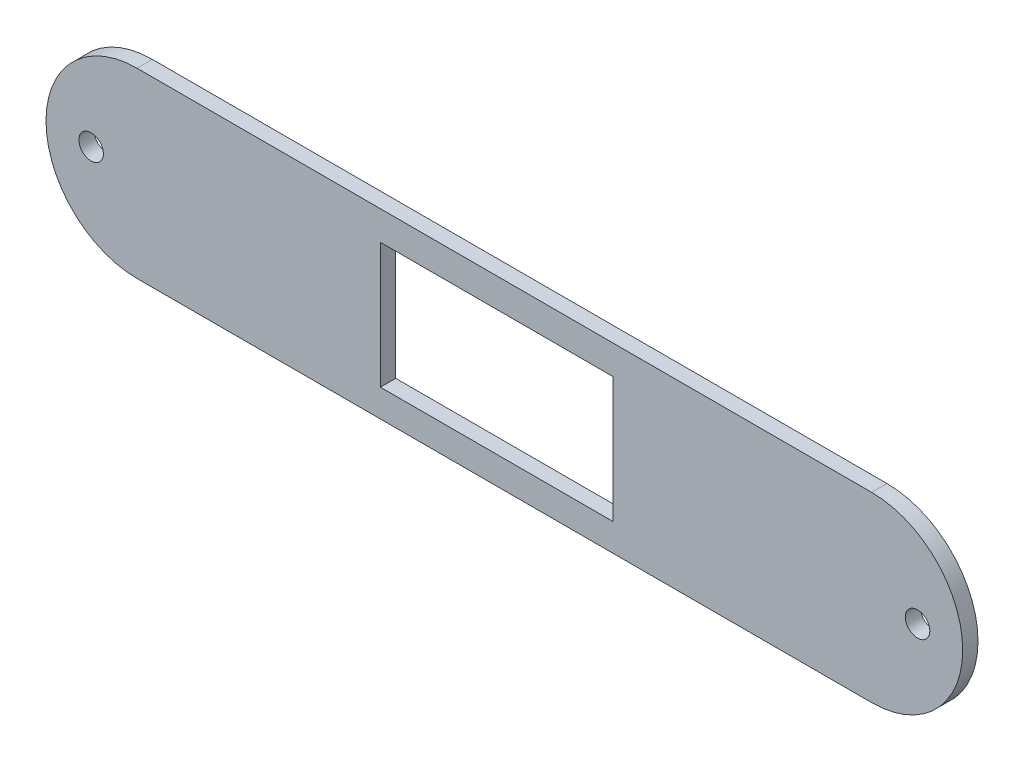
ISO-10303-21;
HEADER;
FILE_DESCRIPTION(('STEP AP214'),'2;1');
FILE_NAME('part.step','',(''),(''),'','','');
FILE_SCHEMA(('AUTOMOTIVE_DESIGN { 1 0 10303 214 1 1 1 1 }'));
ENDSEC;
DATA;
#1=APPLICATION_CONTEXT('core data for automotive mechanical design processes');
#2=APPLICATION_PROTOCOL_DEFINITION('international standard','automotive_design',2000,#1);
#3=PRODUCT_CONTEXT('',#1,'mechanical');
#4=PRODUCT('Part','Part','',(#3));
#5=PRODUCT_RELATED_PRODUCT_CATEGORY('part','',(#4));
#6=PRODUCT_DEFINITION_FORMATION('','',#4);
#7=PRODUCT_DEFINITION_CONTEXT('part definition',#1,'design');
#8=PRODUCT_DEFINITION('design','',#6,#7);
#9=PRODUCT_DEFINITION_SHAPE('','',#8);
#10=(LENGTH_UNIT() NAMED_UNIT(*) SI_UNIT(.MILLI.,.METRE.));
#11=(NAMED_UNIT(*) PLANE_ANGLE_UNIT() SI_UNIT($,.RADIAN.));
#12=(NAMED_UNIT(*) SI_UNIT($,.STERADIAN.) SOLID_ANGLE_UNIT());
#13=UNCERTAINTY_MEASURE_WITH_UNIT(LENGTH_MEASURE(1.E-05),#10,'distance_accuracy_value','');
#14=(GEOMETRIC_REPRESENTATION_CONTEXT(3) GLOBAL_UNCERTAINTY_ASSIGNED_CONTEXT((#13)) GLOBAL_UNIT_ASSIGNED_CONTEXT((#10,
#11,#12)) REPRESENTATION_CONTEXT('',''));
#15=CARTESIAN_POINT('',(0.,0.,0.));
#16=DIRECTION('',(0.,0.,1.));
#17=DIRECTION('',(1.,0.,0.));
#18=AXIS2_PLACEMENT_3D('',#15,#16,#17);
#19=CARTESIAN_POINT('',(24.,0.,1.));
#20=DIRECTION('',(0.,0.,-1.));
#21=DIRECTION('',(-1.,0.,0.));
#22=AXIS2_PLACEMENT_3D('',#19,#20,#21);
#23=CYLINDRICAL_SURFACE('',#22,5.95);
#24=CARTESIAN_POINT('',(24.,0.,0.));
#25=DIRECTION('',(0.,0.,1.));
#26=DIRECTION('',(1.,0.,0.));
#27=AXIS2_PLACEMENT_3D('',#24,#25,#26);
#28=CIRCLE('',#27,5.95);
#29=CARTESIAN_POINT('',(24.,-5.94999999999999,0.));
#30=VERTEX_POINT('',#29);
#31=CARTESIAN_POINT('',(24.,5.95000000000002,0.));
#32=VERTEX_POINT('',#31);
#33=EDGE_CURVE('E145',#30,#32,#28,.T.);
#34=ORIENTED_EDGE('',*,*,#33,.T.);
#35=DIRECTION('',(0.,0.,-1.));
#36=VECTOR('',#35,1.);
#37=CARTESIAN_POINT('',(24.,5.95000000000002,1.));
#38=LINE('',#37,#36);
#39=CARTESIAN_POINT('',(24.,5.95000000000002,1.));
#40=VERTEX_POINT('',#39);
#41=EDGE_CURVE('E11',#40,#32,#38,.T.);
#42=ORIENTED_EDGE('',*,*,#41,.F.);
#43=CARTESIAN_POINT('',(24.,0.,1.));
#44=DIRECTION('',(0.,0.,1.));
#45=DIRECTION('',(1.,0.,0.));
#46=AXIS2_PLACEMENT_3D('',#43,#44,#45);
#47=CIRCLE('',#46,5.95);
#48=CARTESIAN_POINT('',(24.,-5.94999999999999,1.));
#49=VERTEX_POINT('',#48);
#50=EDGE_CURVE('E148',#49,#40,#47,.T.);
#51=ORIENTED_EDGE('',*,*,#50,.F.);
#52=DIRECTION('',(0.,0.,-1.));
#53=VECTOR('',#52,1.);
#54=CARTESIAN_POINT('',(24.,-5.94999999999999,1.));
#55=LINE('',#54,#53);
#56=EDGE_CURVE('E158',#49,#30,#55,.T.);
#57=ORIENTED_EDGE('',*,*,#56,.T.);
#58=EDGE_LOOP('',(#34,#42,#51,#57));
#59=FACE_BOUND('',#58,.T.);
#60=ADVANCED_FACE('F35',(#59),#23,.T.);
#61=CARTESIAN_POINT('',(24.,5.95000000000002,1.));
#62=DIRECTION('',(0.,-1.,0.));
#63=DIRECTION('',(1.,0.,0.));
#64=AXIS2_PLACEMENT_3D('',#61,#62,#63);
#65=PLANE('',#64);
#66=DIRECTION('',(-1.,0.,0.));
#67=VECTOR('',#66,1.);
#68=CARTESIAN_POINT('',(24.,5.95000000000002,0.));
#69=LINE('',#68,#67);
#70=CARTESIAN_POINT('',(-24.,5.95,0.));
#71=VERTEX_POINT('',#70);
#72=EDGE_CURVE('E161',#32,#71,#69,.T.);
#73=ORIENTED_EDGE('',*,*,#72,.T.);
#74=DIRECTION('',(0.,0.,-1.));
#75=VECTOR('',#74,1.);
#76=CARTESIAN_POINT('',(-24.,5.95,1.));
#77=LINE('',#76,#75);
#78=CARTESIAN_POINT('',(-24.,5.95,1.));
#79=VERTEX_POINT('',#78);
#80=EDGE_CURVE('E42',#79,#71,#77,.T.);
#81=ORIENTED_EDGE('',*,*,#80,.F.);
#82=DIRECTION('',(-1.,0.,0.));
#83=VECTOR('',#82,1.);
#84=CARTESIAN_POINT('',(24.,5.95000000000002,1.));
#85=LINE('',#84,#83);
#86=EDGE_CURVE('E151',#40,#79,#85,.T.);
#87=ORIENTED_EDGE('',*,*,#86,.F.);
#88=ORIENTED_EDGE('',*,*,#41,.T.);
#89=EDGE_LOOP('',(#73,#81,#87,#88));
#90=FACE_BOUND('',#89,.T.);
#91=ADVANCED_FACE('F190',(#90),#65,.F.);
#92=CARTESIAN_POINT('',(-24.,0.,1.));
#93=DIRECTION('',(0.,0.,-1.));
#94=DIRECTION('',(-1.,0.,0.));
#95=AXIS2_PLACEMENT_3D('',#92,#93,#94);
#96=CYLINDRICAL_SURFACE('',#95,5.95);
#97=CARTESIAN_POINT('',(-24.,0.,0.));
#98=DIRECTION('',(0.,0.,1.));
#99=DIRECTION('',(1.,0.,0.));
#100=AXIS2_PLACEMENT_3D('',#97,#98,#99);
#101=CIRCLE('',#100,5.95);
#102=CARTESIAN_POINT('',(-24.,-5.95,0.));
#103=VERTEX_POINT('',#102);
#104=EDGE_CURVE('E163',#71,#103,#101,.T.);
#105=ORIENTED_EDGE('',*,*,#104,.T.);
#106=DIRECTION('',(0.,0.,-1.));
#107=VECTOR('',#106,1.);
#108=CARTESIAN_POINT('',(-24.,-5.95,1.));
#109=LINE('',#108,#107);
#110=CARTESIAN_POINT('',(-24.,-5.95,1.));
#111=VERTEX_POINT('',#110);
#112=EDGE_CURVE('E168',#111,#103,#109,.T.);
#113=ORIENTED_EDGE('',*,*,#112,.F.);
#114=CARTESIAN_POINT('',(-24.,0.,1.));
#115=DIRECTION('',(0.,0.,1.));
#116=DIRECTION('',(1.,0.,0.));
#117=AXIS2_PLACEMENT_3D('',#114,#115,#116);
#118=CIRCLE('',#117,5.95);
#119=EDGE_CURVE('E154',#79,#111,#118,.T.);
#120=ORIENTED_EDGE('',*,*,#119,.F.);
#121=ORIENTED_EDGE('',*,*,#80,.T.);
#122=EDGE_LOOP('',(#105,#113,#120,#121));
#123=FACE_BOUND('',#122,.T.);
#124=ADVANCED_FACE('F175',(#123),#96,.T.);
#125=CARTESIAN_POINT('',(-24.,-5.95,1.));
#126=DIRECTION('',(0.,1.,0.));
#127=DIRECTION('',(-1.,0.,0.));
#128=AXIS2_PLACEMENT_3D('',#125,#126,#127);
#129=PLANE('',#128);
#130=DIRECTION('',(1.,0.,0.));
#131=VECTOR('',#130,1.);
#132=CARTESIAN_POINT('',(-24.,-5.95,0.));
#133=LINE('',#132,#131);
#134=EDGE_CURVE('E152',#103,#30,#133,.T.);
#135=ORIENTED_EDGE('',*,*,#134,.T.);
#136=ORIENTED_EDGE('',*,*,#56,.F.);
#137=DIRECTION('',(1.,0.,0.));
#138=VECTOR('',#137,1.);
#139=CARTESIAN_POINT('',(-24.,-5.95,1.));
#140=LINE('',#139,#138);
#141=EDGE_CURVE('E156',#111,#49,#140,.T.);
#142=ORIENTED_EDGE('',*,*,#141,.F.);
#143=ORIENTED_EDGE('',*,*,#112,.T.);
#144=EDGE_LOOP('',(#135,#136,#142,#143));
#145=FACE_BOUND('',#144,.T.);
#146=ADVANCED_FACE('F183',(#145),#129,.F.);
#147=CARTESIAN_POINT('',(24.,0.,1.));
#148=DIRECTION('',(0.,0.,1.));
#149=DIRECTION('',(1.,0.,0.));
#150=AXIS2_PLACEMENT_3D('',#147,#148,#149);
#151=PLANE('',#150);
#152=DIRECTION('',(0.,-1.,0.));
#153=VECTOR('',#152,1.);
#154=CARTESIAN_POINT('',(-8.1,-4.15,1.));
#155=LINE('',#154,#153);
#156=CARTESIAN_POINT('',(-8.1,4.05,1.));
#157=VERTEX_POINT('',#156);
#158=CARTESIAN_POINT('',(-8.1,-4.15,1.));
#159=VERTEX_POINT('',#158);
#160=EDGE_CURVE('E49',#157,#159,#155,.T.);
#161=ORIENTED_EDGE('',*,*,#160,.F.);
#162=DIRECTION('',(-1.,0.,0.));
#163=VECTOR('',#162,1.);
#164=CARTESIAN_POINT('',(-8.1,4.05,1.));
#165=LINE('',#164,#163);
#166=CARTESIAN_POINT('',(7.1,4.05,1.));
#167=VERTEX_POINT('',#166);
#168=EDGE_CURVE('E117',#167,#157,#165,.T.);
#169=ORIENTED_EDGE('',*,*,#168,.F.);
#170=DIRECTION('',(0.,1.,0.));
#171=VECTOR('',#170,1.);
#172=CARTESIAN_POINT('',(7.1,-4.15,1.));
#173=LINE('',#172,#171);
#174=CARTESIAN_POINT('',(7.1,-4.15,1.));
#175=VERTEX_POINT('',#174);
#176=EDGE_CURVE('E120',#175,#167,#173,.T.);
#177=ORIENTED_EDGE('',*,*,#176,.F.);
#178=DIRECTION('',(1.,0.,0.));
#179=VECTOR('',#178,1.);
#180=CARTESIAN_POINT('',(-8.1,-4.15,1.));
#181=LINE('',#180,#179);
#182=EDGE_CURVE('E126',#159,#175,#181,.T.);
#183=ORIENTED_EDGE('',*,*,#182,.F.);
#184=EDGE_LOOP('',(#161,#169,#177,#183));
#185=FACE_BOUND('',#184,.T.);
#186=CARTESIAN_POINT('',(27.,0.,1.));
#187=DIRECTION('',(0.,0.,1.));
#188=DIRECTION('',(1.,0.,0.));
#189=AXIS2_PLACEMENT_3D('',#186,#187,#188);
#190=CIRCLE('',#189,0.799999999999999);
#191=CARTESIAN_POINT('',(27.8,0.,1.));
#192=VERTEX_POINT('',#191);
#193=EDGE_CURVE('E136',#192,#192,#190,.T.);
#194=ORIENTED_EDGE('',*,*,#193,.F.);
#195=EDGE_LOOP('',(#194));
#196=FACE_BOUND('',#195,.T.);
#197=CARTESIAN_POINT('',(-27.,0.,1.));
#198=DIRECTION('',(0.,0.,1.));
#199=DIRECTION('',(1.,0.,0.));
#200=AXIS2_PLACEMENT_3D('',#197,#198,#199);
#201=CIRCLE('',#200,0.799999999999999);
#202=CARTESIAN_POINT('',(-26.2,0.,1.));
#203=VERTEX_POINT('',#202);
#204=EDGE_CURVE('E139',#203,#203,#201,.T.);
#205=ORIENTED_EDGE('',*,*,#204,.F.);
#206=EDGE_LOOP('',(#205));
#207=FACE_BOUND('',#206,.T.);
#208=ORIENTED_EDGE('',*,*,#50,.T.);
#209=ORIENTED_EDGE('',*,*,#86,.T.);
#210=ORIENTED_EDGE('',*,*,#119,.T.);
#211=ORIENTED_EDGE('',*,*,#141,.T.);
#212=EDGE_LOOP('',(#208,#209,#210,#211));
#213=FACE_BOUND('',#212,.T.);
#214=ADVANCED_FACE('F189',(#185,#196,#207,#213),#151,.T.);
#215=CARTESIAN_POINT('',(24.,0.,0.));
#216=DIRECTION('',(0.,0.,1.));
#217=DIRECTION('',(1.,0.,0.));
#218=AXIS2_PLACEMENT_3D('',#215,#216,#217);
#219=PLANE('',#218);
#220=DIRECTION('',(-1.,0.,0.));
#221=VECTOR('',#220,1.);
#222=CARTESIAN_POINT('',(-8.1,4.05,0.));
#223=LINE('',#222,#221);
#224=CARTESIAN_POINT('',(7.1,4.05,0.));
#225=VERTEX_POINT('',#224);
#226=CARTESIAN_POINT('',(-8.1,4.05,0.));
#227=VERTEX_POINT('',#226);
#228=EDGE_CURVE('E107',#225,#227,#223,.T.);
#229=ORIENTED_EDGE('',*,*,#228,.T.);
#230=DIRECTION('',(0.,-1.,0.));
#231=VECTOR('',#230,1.);
#232=CARTESIAN_POINT('',(-8.1,-4.15,0.));
#233=LINE('',#232,#231);
#234=CARTESIAN_POINT('',(-8.1,-4.15,0.));
#235=VERTEX_POINT('',#234);
#236=EDGE_CURVE('E101',#227,#235,#233,.T.);
#237=ORIENTED_EDGE('',*,*,#236,.T.);
#238=DIRECTION('',(1.,0.,0.));
#239=VECTOR('',#238,1.);
#240=CARTESIAN_POINT('',(-8.1,-4.15,0.));
#241=LINE('',#240,#239);
#242=CARTESIAN_POINT('',(7.1,-4.15,0.));
#243=VERTEX_POINT('',#242);
#244=EDGE_CURVE('E110',#235,#243,#241,.T.);
#245=ORIENTED_EDGE('',*,*,#244,.T.);
#246=DIRECTION('',(0.,1.,0.));
#247=VECTOR('',#246,1.);
#248=CARTESIAN_POINT('',(7.1,-4.15,0.));
#249=LINE('',#248,#247);
#250=EDGE_CURVE('E57',#243,#225,#249,.T.);
#251=ORIENTED_EDGE('',*,*,#250,.T.);
#252=EDGE_LOOP('',(#229,#237,#245,#251));
#253=FACE_BOUND('',#252,.T.);
#254=CARTESIAN_POINT('',(27.,0.,0.));
#255=DIRECTION('',(0.,0.,1.));
#256=DIRECTION('',(1.,0.,0.));
#257=AXIS2_PLACEMENT_3D('',#254,#255,#256);
#258=CIRCLE('',#257,0.799999999999999);
#259=CARTESIAN_POINT('',(27.8,0.,0.));
#260=VERTEX_POINT('',#259);
#261=EDGE_CURVE('E132',#260,#260,#258,.T.);
#262=ORIENTED_EDGE('',*,*,#261,.T.);
#263=EDGE_LOOP('',(#262));
#264=FACE_BOUND('',#263,.T.);
#265=CARTESIAN_POINT('',(-27.,0.,0.));
#266=DIRECTION('',(0.,0.,1.));
#267=DIRECTION('',(1.,0.,0.));
#268=AXIS2_PLACEMENT_3D('',#265,#266,#267);
#269=CIRCLE('',#268,0.799999999999999);
#270=CARTESIAN_POINT('',(-26.2,0.,0.));
#271=VERTEX_POINT('',#270);
#272=EDGE_CURVE('E142',#271,#271,#269,.T.);
#273=ORIENTED_EDGE('',*,*,#272,.T.);
#274=EDGE_LOOP('',(#273));
#275=FACE_BOUND('',#274,.T.);
#276=ORIENTED_EDGE('',*,*,#33,.F.);
#277=ORIENTED_EDGE('',*,*,#134,.F.);
#278=ORIENTED_EDGE('',*,*,#104,.F.);
#279=ORIENTED_EDGE('',*,*,#72,.F.);
#280=EDGE_LOOP('',(#276,#277,#278,#279));
#281=FACE_BOUND('',#280,.T.);
#282=ADVANCED_FACE('F114',(#253,#264,#275,#281),#219,.F.);
#283=CARTESIAN_POINT('',(-27.,0.,0.));
#284=DIRECTION('',(0.,0.,1.));
#285=DIRECTION('',(1.,0.,0.));
#286=AXIS2_PLACEMENT_3D('',#283,#284,#285);
#287=CYLINDRICAL_SURFACE('',#286,0.799999999999999);
#288=ORIENTED_EDGE('',*,*,#272,.F.);
#289=EDGE_LOOP('',(#288));
#290=FACE_BOUND('',#289,.T.);
#291=ORIENTED_EDGE('',*,*,#204,.T.);
#292=EDGE_LOOP('',(#291));
#293=FACE_BOUND('',#292,.T.);
#294=ADVANCED_FACE('F202',(#290,#293),#287,.F.);
#295=CARTESIAN_POINT('',(27.,0.,0.));
#296=DIRECTION('',(0.,0.,1.));
#297=DIRECTION('',(1.,0.,0.));
#298=AXIS2_PLACEMENT_3D('',#295,#296,#297);
#299=CYLINDRICAL_SURFACE('',#298,0.799999999999999);
#300=ORIENTED_EDGE('',*,*,#261,.F.);
#301=EDGE_LOOP('',(#300));
#302=FACE_BOUND('',#301,.T.);
#303=ORIENTED_EDGE('',*,*,#193,.T.);
#304=EDGE_LOOP('',(#303));
#305=FACE_BOUND('',#304,.T.);
#306=ADVANCED_FACE('F208',(#302,#305),#299,.F.);
#307=CARTESIAN_POINT('',(-8.1,-4.15,0.));
#308=DIRECTION('',(-1.,0.,0.));
#309=DIRECTION('',(0.,0.,1.));
#310=AXIS2_PLACEMENT_3D('',#307,#308,#309);
#311=PLANE('',#310);
#312=ORIENTED_EDGE('',*,*,#160,.T.);
#313=DIRECTION('',(0.,0.,1.));
#314=VECTOR('',#313,1.);
#315=CARTESIAN_POINT('',(-8.1,-4.15,0.));
#316=LINE('',#315,#314);
#317=EDGE_CURVE('E97',#235,#159,#316,.T.);
#318=ORIENTED_EDGE('',*,*,#317,.F.);
#319=ORIENTED_EDGE('',*,*,#236,.F.);
#320=DIRECTION('',(0.,0.,1.));
#321=VECTOR('',#320,1.);
#322=CARTESIAN_POINT('',(-8.1,4.05,0.));
#323=LINE('',#322,#321);
#324=EDGE_CURVE('E130',#227,#157,#323,.T.);
#325=ORIENTED_EDGE('',*,*,#324,.T.);
#326=EDGE_LOOP('',(#312,#318,#319,#325));
#327=FACE_BOUND('',#326,.T.);
#328=ADVANCED_FACE('F99',(#327),#311,.F.);
#329=CARTESIAN_POINT('',(-8.1,4.05,0.));
#330=DIRECTION('',(0.,1.,0.));
#331=DIRECTION('',(0.,0.,1.));
#332=AXIS2_PLACEMENT_3D('',#329,#330,#331);
#333=PLANE('',#332);
#334=ORIENTED_EDGE('',*,*,#168,.T.);
#335=ORIENTED_EDGE('',*,*,#324,.F.);
#336=ORIENTED_EDGE('',*,*,#228,.F.);
#337=DIRECTION('',(0.,0.,1.));
#338=VECTOR('',#337,1.);
#339=CARTESIAN_POINT('',(7.1,4.05,0.));
#340=LINE('',#339,#338);
#341=EDGE_CURVE('E133',#225,#167,#340,.T.);
#342=ORIENTED_EDGE('',*,*,#341,.T.);
#343=EDGE_LOOP('',(#334,#335,#336,#342));
#344=FACE_BOUND('',#343,.T.);
#345=ADVANCED_FACE('F215',(#344),#333,.F.);
#346=CARTESIAN_POINT('',(7.1,-4.15,0.));
#347=DIRECTION('',(1.,0.,0.));
#348=DIRECTION('',(0.,1.,0.));
#349=AXIS2_PLACEMENT_3D('',#346,#347,#348);
#350=PLANE('',#349);
#351=ORIENTED_EDGE('',*,*,#176,.T.);
#352=ORIENTED_EDGE('',*,*,#341,.F.);
#353=ORIENTED_EDGE('',*,*,#250,.F.);
#354=DIRECTION('',(0.,0.,1.));
#355=VECTOR('',#354,1.);
#356=CARTESIAN_POINT('',(7.1,-4.15,0.));
#357=LINE('',#356,#355);
#358=EDGE_CURVE('E106',#243,#175,#357,.T.);
#359=ORIENTED_EDGE('',*,*,#358,.T.);
#360=EDGE_LOOP('',(#351,#352,#353,#359));
#361=FACE_BOUND('',#360,.T.);
#362=ADVANCED_FACE('F218',(#361),#350,.F.);
#363=CARTESIAN_POINT('',(-8.1,-4.15,0.));
#364=DIRECTION('',(0.,-1.,0.));
#365=DIRECTION('',(0.,0.,-1.));
#366=AXIS2_PLACEMENT_3D('',#363,#364,#365);
#367=PLANE('',#366);
#368=ORIENTED_EDGE('',*,*,#182,.T.);
#369=ORIENTED_EDGE('',*,*,#358,.F.);
#370=ORIENTED_EDGE('',*,*,#244,.F.);
#371=ORIENTED_EDGE('',*,*,#317,.T.);
#372=EDGE_LOOP('',(#368,#369,#370,#371));
#373=FACE_BOUND('',#372,.T.);
#374=ADVANCED_FACE('F111',(#373),#367,.F.);
#375=CLOSED_SHELL('',(#60,#91,#124,#146,#214,#282,#294,#306,#328,#345,#362,#374));
#376=MANIFOLD_SOLID_BREP('B2',#375);
#377=ADVANCED_BREP_SHAPE_REPRESENTATION('',(#18,#376),#14);
#378=SHAPE_DEFINITION_REPRESENTATION(#9,#377);
ENDSEC;
END-ISO-10303-21;
